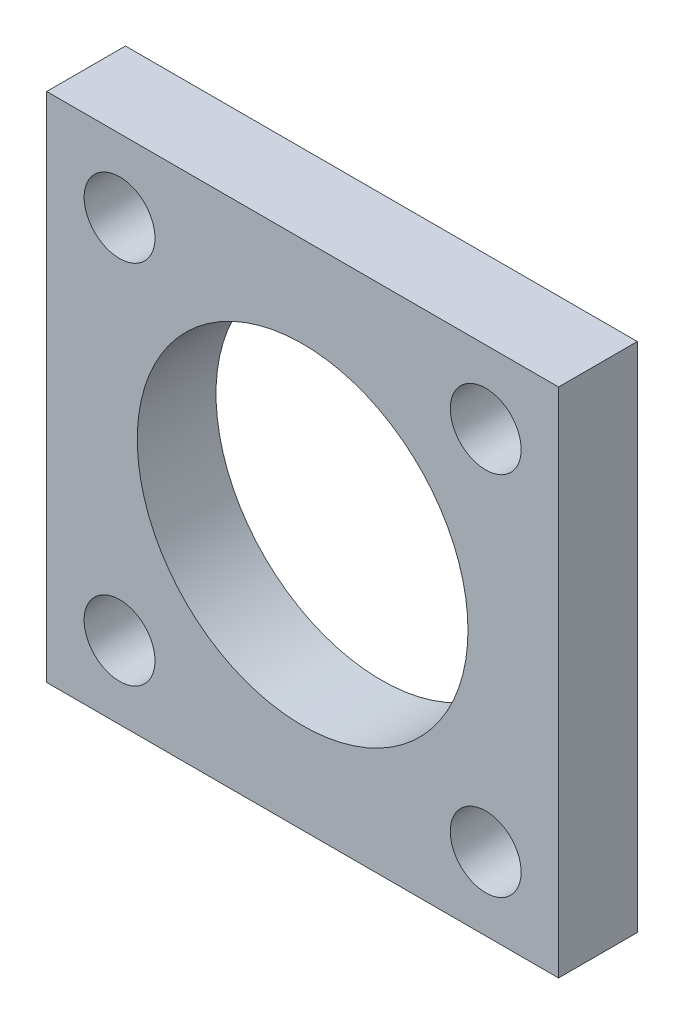
ISO-10303-21;
HEADER;
FILE_DESCRIPTION(('STEP AP214'),'2;1');
FILE_NAME('part.step','',(''),(''),'','','');
FILE_SCHEMA(('AUTOMOTIVE_DESIGN { 1 0 10303 214 1 1 1 1 }'));
ENDSEC;
DATA;
#1=APPLICATION_CONTEXT('core data for automotive mechanical design processes');
#2=APPLICATION_PROTOCOL_DEFINITION('international standard','automotive_design',2000,#1);
#3=PRODUCT_CONTEXT('',#1,'mechanical');
#4=PRODUCT('Part','Part','',(#3));
#5=PRODUCT_RELATED_PRODUCT_CATEGORY('part','',(#4));
#6=PRODUCT_DEFINITION_FORMATION('','',#4);
#7=PRODUCT_DEFINITION_CONTEXT('part definition',#1,'design');
#8=PRODUCT_DEFINITION('design','',#6,#7);
#9=PRODUCT_DEFINITION_SHAPE('','',#8);
#10=(LENGTH_UNIT() NAMED_UNIT(*) SI_UNIT(.MILLI.,.METRE.));
#11=(NAMED_UNIT(*) PLANE_ANGLE_UNIT() SI_UNIT($,.RADIAN.));
#12=(NAMED_UNIT(*) SI_UNIT($,.STERADIAN.) SOLID_ANGLE_UNIT());
#13=UNCERTAINTY_MEASURE_WITH_UNIT(LENGTH_MEASURE(1.E-05),#10,'distance_accuracy_value','');
#14=(GEOMETRIC_REPRESENTATION_CONTEXT(3) GLOBAL_UNCERTAINTY_ASSIGNED_CONTEXT((#13)) GLOBAL_UNIT_ASSIGNED_CONTEXT((#10,
#11,#12)) REPRESENTATION_CONTEXT('',''));
#15=CARTESIAN_POINT('',(0.,0.,0.));
#16=DIRECTION('',(0.,0.,1.));
#17=DIRECTION('',(1.,0.,0.));
#18=AXIS2_PLACEMENT_3D('',#15,#16,#17);
#19=CARTESIAN_POINT('',(0.,0.,10.));
#20=DIRECTION('',(0.,0.,1.));
#21=DIRECTION('',(1.,0.,0.));
#22=AXIS2_PLACEMENT_3D('',#19,#20,#21);
#23=PLANE('',#22);
#24=CARTESIAN_POINT('',(23.25,-23.25,10.));
#25=DIRECTION('',(0.,0.,1.));
#26=DIRECTION('',(1.,0.,0.));
#27=AXIS2_PLACEMENT_3D('',#24,#25,#26);
#28=CIRCLE('',#27,4.5);
#29=CARTESIAN_POINT('',(27.75,-23.25,10.));
#30=VERTEX_POINT('',#29);
#31=EDGE_CURVE('E150',#30,#30,#28,.T.);
#32=ORIENTED_EDGE('',*,*,#31,.F.);
#33=EDGE_LOOP('',(#32));
#34=FACE_BOUND('',#33,.T.);
#35=CARTESIAN_POINT('',(0.,0.,10.));
#36=DIRECTION('',(0.,0.,1.));
#37=DIRECTION('',(1.,0.,0.));
#38=AXIS2_PLACEMENT_3D('',#35,#36,#37);
#39=CIRCLE('',#38,21.);
#40=CARTESIAN_POINT('',(21.,0.,10.));
#41=VERTEX_POINT('',#40);
#42=EDGE_CURVE('E134',#41,#41,#39,.T.);
#43=ORIENTED_EDGE('',*,*,#42,.F.);
#44=EDGE_LOOP('',(#43));
#45=FACE_BOUND('',#44,.T.);
#46=DIRECTION('',(0.,1.,0.));
#47=VECTOR('',#46,1.);
#48=CARTESIAN_POINT('',(32.5,32.5,10.));
#49=LINE('',#48,#47);
#50=CARTESIAN_POINT('',(32.5,-32.5,10.));
#51=VERTEX_POINT('',#50);
#52=CARTESIAN_POINT('',(32.5,32.5,10.));
#53=VERTEX_POINT('',#52);
#54=EDGE_CURVE('E92',#51,#53,#49,.T.);
#55=ORIENTED_EDGE('',*,*,#54,.T.);
#56=DIRECTION('',(-1.,0.,0.));
#57=VECTOR('',#56,1.);
#58=CARTESIAN_POINT('',(-32.5,32.5,10.));
#59=LINE('',#58,#57);
#60=CARTESIAN_POINT('',(-32.5,32.5,10.));
#61=VERTEX_POINT('',#60);
#62=EDGE_CURVE('E87',#53,#61,#59,.T.);
#63=ORIENTED_EDGE('',*,*,#62,.T.);
#64=DIRECTION('',(0.,-1.,0.));
#65=VECTOR('',#64,1.);
#66=CARTESIAN_POINT('',(-32.5,32.5,10.));
#67=LINE('',#66,#65);
#68=CARTESIAN_POINT('',(-32.5,-32.5,10.));
#69=VERTEX_POINT('',#68);
#70=EDGE_CURVE('E90',#61,#69,#67,.T.);
#71=ORIENTED_EDGE('',*,*,#70,.T.);
#72=DIRECTION('',(1.,0.,0.));
#73=VECTOR('',#72,1.);
#74=CARTESIAN_POINT('',(-32.5,-32.5,10.));
#75=LINE('',#74,#73);
#76=EDGE_CURVE('E57',#69,#51,#75,.T.);
#77=ORIENTED_EDGE('',*,*,#76,.T.);
#78=EDGE_LOOP('',(#55,#63,#71,#77));
#79=FACE_BOUND('',#78,.T.);
#80=CARTESIAN_POINT('',(-23.25,23.25,10.));
#81=DIRECTION('',(0.,0.,1.));
#82=DIRECTION('',(1.,0.,0.));
#83=AXIS2_PLACEMENT_3D('',#80,#81,#82);
#84=CIRCLE('',#83,4.5);
#85=CARTESIAN_POINT('',(-18.75,23.25,10.));
#86=VERTEX_POINT('',#85);
#87=EDGE_CURVE('E112',#86,#86,#84,.T.);
#88=ORIENTED_EDGE('',*,*,#87,.F.);
#89=EDGE_LOOP('',(#88));
#90=FACE_BOUND('',#89,.T.);
#91=CARTESIAN_POINT('',(23.25,23.25,10.));
#92=DIRECTION('',(0.,0.,1.));
#93=DIRECTION('',(1.,0.,0.));
#94=AXIS2_PLACEMENT_3D('',#91,#92,#93);
#95=CIRCLE('',#94,4.5);
#96=CARTESIAN_POINT('',(27.75,23.25,10.));
#97=VERTEX_POINT('',#96);
#98=EDGE_CURVE('E142',#97,#97,#95,.T.);
#99=ORIENTED_EDGE('',*,*,#98,.F.);
#100=EDGE_LOOP('',(#99));
#101=FACE_BOUND('',#100,.T.);
#102=CARTESIAN_POINT('',(-23.25,-23.25,10.));
#103=DIRECTION('',(0.,0.,1.));
#104=DIRECTION('',(1.,0.,0.));
#105=AXIS2_PLACEMENT_3D('',#102,#103,#104);
#106=CIRCLE('',#105,4.5);
#107=CARTESIAN_POINT('',(-18.75,-23.25,10.));
#108=VERTEX_POINT('',#107);
#109=EDGE_CURVE('E158',#108,#108,#106,.T.);
#110=ORIENTED_EDGE('',*,*,#109,.F.);
#111=EDGE_LOOP('',(#110));
#112=FACE_BOUND('',#111,.T.);
#113=ADVANCED_FACE('F39',(#34,#45,#79,#90,#101,#112),#23,.T.);
#114=CARTESIAN_POINT('',(0.,0.,0.));
#115=DIRECTION('',(0.,0.,1.));
#116=DIRECTION('',(1.,0.,0.));
#117=AXIS2_PLACEMENT_3D('',#114,#115,#116);
#118=PLANE('',#117);
#119=DIRECTION('',(0.,1.,0.));
#120=VECTOR('',#119,1.);
#121=CARTESIAN_POINT('',(32.5,32.5,0.));
#122=LINE('',#121,#120);
#123=CARTESIAN_POINT('',(32.5,-32.5,0.));
#124=VERTEX_POINT('',#123);
#125=CARTESIAN_POINT('',(32.5,32.5,0.));
#126=VERTEX_POINT('',#125);
#127=EDGE_CURVE('E108',#124,#126,#122,.T.);
#128=ORIENTED_EDGE('',*,*,#127,.F.);
#129=DIRECTION('',(1.,0.,0.));
#130=VECTOR('',#129,1.);
#131=CARTESIAN_POINT('',(-32.5,-32.5,0.));
#132=LINE('',#131,#130);
#133=CARTESIAN_POINT('',(-32.5,-32.5,0.));
#134=VERTEX_POINT('',#133);
#135=EDGE_CURVE('E80',#134,#124,#132,.T.);
#136=ORIENTED_EDGE('',*,*,#135,.F.);
#137=DIRECTION('',(0.,-1.,0.));
#138=VECTOR('',#137,1.);
#139=CARTESIAN_POINT('',(-32.5,32.5,0.));
#140=LINE('',#139,#138);
#141=CARTESIAN_POINT('',(-32.5,32.5,0.));
#142=VERTEX_POINT('',#141);
#143=EDGE_CURVE('E74',#142,#134,#140,.T.);
#144=ORIENTED_EDGE('',*,*,#143,.F.);
#145=DIRECTION('',(-1.,0.,0.));
#146=VECTOR('',#145,1.);
#147=CARTESIAN_POINT('',(-32.5,32.5,0.));
#148=LINE('',#147,#146);
#149=EDGE_CURVE('E97',#126,#142,#148,.T.);
#150=ORIENTED_EDGE('',*,*,#149,.F.);
#151=EDGE_LOOP('',(#128,#136,#144,#150));
#152=FACE_BOUND('',#151,.T.);
#153=CARTESIAN_POINT('',(-23.25,23.25,0.));
#154=DIRECTION('',(0.,0.,1.));
#155=DIRECTION('',(1.,0.,0.));
#156=AXIS2_PLACEMENT_3D('',#153,#154,#155);
#157=CIRCLE('',#156,4.5);
#158=CARTESIAN_POINT('',(-18.75,23.25,0.));
#159=VERTEX_POINT('',#158);
#160=EDGE_CURVE('E130',#159,#159,#157,.T.);
#161=ORIENTED_EDGE('',*,*,#160,.T.);
#162=EDGE_LOOP('',(#161));
#163=FACE_BOUND('',#162,.T.);
#164=CARTESIAN_POINT('',(0.,0.,0.));
#165=DIRECTION('',(0.,0.,1.));
#166=DIRECTION('',(1.,0.,0.));
#167=AXIS2_PLACEMENT_3D('',#164,#165,#166);
#168=CIRCLE('',#167,21.);
#169=CARTESIAN_POINT('',(21.,0.,0.));
#170=VERTEX_POINT('',#169);
#171=EDGE_CURVE('E138',#170,#170,#168,.T.);
#172=ORIENTED_EDGE('',*,*,#171,.T.);
#173=EDGE_LOOP('',(#172));
#174=FACE_BOUND('',#173,.T.);
#175=CARTESIAN_POINT('',(23.25,23.25,0.));
#176=DIRECTION('',(0.,0.,1.));
#177=DIRECTION('',(1.,0.,0.));
#178=AXIS2_PLACEMENT_3D('',#175,#176,#177);
#179=CIRCLE('',#178,4.5);
#180=CARTESIAN_POINT('',(27.75,23.25,0.));
#181=VERTEX_POINT('',#180);
#182=EDGE_CURVE('E146',#181,#181,#179,.T.);
#183=ORIENTED_EDGE('',*,*,#182,.T.);
#184=EDGE_LOOP('',(#183));
#185=FACE_BOUND('',#184,.T.);
#186=CARTESIAN_POINT('',(23.25,-23.25,0.));
#187=DIRECTION('',(0.,0.,1.));
#188=DIRECTION('',(1.,0.,0.));
#189=AXIS2_PLACEMENT_3D('',#186,#187,#188);
#190=CIRCLE('',#189,4.5);
#191=CARTESIAN_POINT('',(27.75,-23.25,0.));
#192=VERTEX_POINT('',#191);
#193=EDGE_CURVE('E154',#192,#192,#190,.T.);
#194=ORIENTED_EDGE('',*,*,#193,.T.);
#195=EDGE_LOOP('',(#194));
#196=FACE_BOUND('',#195,.T.);
#197=CARTESIAN_POINT('',(-23.25,-23.25,0.));
#198=DIRECTION('',(0.,0.,1.));
#199=DIRECTION('',(1.,0.,0.));
#200=AXIS2_PLACEMENT_3D('',#197,#198,#199);
#201=CIRCLE('',#200,4.5);
#202=CARTESIAN_POINT('',(-18.75,-23.25,0.));
#203=VERTEX_POINT('',#202);
#204=EDGE_CURVE('E162',#203,#203,#201,.T.);
#205=ORIENTED_EDGE('',*,*,#204,.T.);
#206=EDGE_LOOP('',(#205));
#207=FACE_BOUND('',#206,.T.);
#208=ADVANCED_FACE('F125',(#152,#163,#174,#185,#196,#207),#118,.F.);
#209=CARTESIAN_POINT('',(32.5,32.5,10.));
#210=DIRECTION('',(-1.,0.,0.));
#211=DIRECTION('',(0.,0.,1.));
#212=AXIS2_PLACEMENT_3D('',#209,#210,#211);
#213=PLANE('',#212);
#214=ORIENTED_EDGE('',*,*,#127,.T.);
#215=DIRECTION('',(0.,0.,-1.));
#216=VECTOR('',#215,1.);
#217=CARTESIAN_POINT('',(32.5,32.5,10.));
#218=LINE('',#217,#216);
#219=EDGE_CURVE('E11',#53,#126,#218,.T.);
#220=ORIENTED_EDGE('',*,*,#219,.F.);
#221=ORIENTED_EDGE('',*,*,#54,.F.);
#222=DIRECTION('',(0.,0.,-1.));
#223=VECTOR('',#222,1.);
#224=CARTESIAN_POINT('',(32.5,-32.5,10.));
#225=LINE('',#224,#223);
#226=EDGE_CURVE('E104',#51,#124,#225,.T.);
#227=ORIENTED_EDGE('',*,*,#226,.T.);
#228=EDGE_LOOP('',(#214,#220,#221,#227));
#229=FACE_BOUND('',#228,.T.);
#230=ADVANCED_FACE('F41',(#229),#213,.F.);
#231=CARTESIAN_POINT('',(-32.5,32.5,10.));
#232=DIRECTION('',(0.,-1.,0.));
#233=DIRECTION('',(0.,0.,-1.));
#234=AXIS2_PLACEMENT_3D('',#231,#232,#233);
#235=PLANE('',#234);
#236=ORIENTED_EDGE('',*,*,#149,.T.);
#237=DIRECTION('',(0.,0.,-1.));
#238=VECTOR('',#237,1.);
#239=CARTESIAN_POINT('',(-32.5,32.5,10.));
#240=LINE('',#239,#238);
#241=EDGE_CURVE('E49',#61,#142,#240,.T.);
#242=ORIENTED_EDGE('',*,*,#241,.F.);
#243=ORIENTED_EDGE('',*,*,#62,.F.);
#244=ORIENTED_EDGE('',*,*,#219,.T.);
#245=EDGE_LOOP('',(#236,#242,#243,#244));
#246=FACE_BOUND('',#245,.T.);
#247=ADVANCED_FACE('F96',(#246),#235,.F.);
#248=CARTESIAN_POINT('',(-32.5,32.5,10.));
#249=DIRECTION('',(1.,0.,0.));
#250=DIRECTION('',(0.,1.,0.));
#251=AXIS2_PLACEMENT_3D('',#248,#249,#250);
#252=PLANE('',#251);
#253=ORIENTED_EDGE('',*,*,#143,.T.);
#254=DIRECTION('',(0.,0.,-1.));
#255=VECTOR('',#254,1.);
#256=CARTESIAN_POINT('',(-32.5,-32.5,10.));
#257=LINE('',#256,#255);
#258=EDGE_CURVE('E99',#69,#134,#257,.T.);
#259=ORIENTED_EDGE('',*,*,#258,.F.);
#260=ORIENTED_EDGE('',*,*,#70,.F.);
#261=ORIENTED_EDGE('',*,*,#241,.T.);
#262=EDGE_LOOP('',(#253,#259,#260,#261));
#263=FACE_BOUND('',#262,.T.);
#264=ADVANCED_FACE('F100',(#263),#252,.F.);
#265=CARTESIAN_POINT('',(-32.5,-32.5,10.));
#266=DIRECTION('',(0.,1.,0.));
#267=DIRECTION('',(0.,0.,1.));
#268=AXIS2_PLACEMENT_3D('',#265,#266,#267);
#269=PLANE('',#268);
#270=ORIENTED_EDGE('',*,*,#135,.T.);
#271=ORIENTED_EDGE('',*,*,#226,.F.);
#272=ORIENTED_EDGE('',*,*,#76,.F.);
#273=ORIENTED_EDGE('',*,*,#258,.T.);
#274=EDGE_LOOP('',(#270,#271,#272,#273));
#275=FACE_BOUND('',#274,.T.);
#276=ADVANCED_FACE('F122',(#275),#269,.F.);
#277=CARTESIAN_POINT('',(-23.25,23.25,10.));
#278=DIRECTION('',(0.,0.,-1.));
#279=DIRECTION('',(-1.,0.,0.));
#280=AXIS2_PLACEMENT_3D('',#277,#278,#279);
#281=CYLINDRICAL_SURFACE('',#280,4.5);
#282=ORIENTED_EDGE('',*,*,#87,.T.);
#283=EDGE_LOOP('',(#282));
#284=FACE_BOUND('',#283,.T.);
#285=ORIENTED_EDGE('',*,*,#160,.F.);
#286=EDGE_LOOP('',(#285));
#287=FACE_BOUND('',#286,.T.);
#288=ADVANCED_FACE('F183',(#284,#287),#281,.F.);
#289=CARTESIAN_POINT('',(0.,0.,10.));
#290=DIRECTION('',(0.,0.,-1.));
#291=DIRECTION('',(-1.,0.,0.));
#292=AXIS2_PLACEMENT_3D('',#289,#290,#291);
#293=CYLINDRICAL_SURFACE('',#292,21.);
#294=ORIENTED_EDGE('',*,*,#42,.T.);
#295=EDGE_LOOP('',(#294));
#296=FACE_BOUND('',#295,.T.);
#297=ORIENTED_EDGE('',*,*,#171,.F.);
#298=EDGE_LOOP('',(#297));
#299=FACE_BOUND('',#298,.T.);
#300=ADVANCED_FACE('F229',(#296,#299),#293,.F.);
#301=CARTESIAN_POINT('',(23.25,23.25,10.));
#302=DIRECTION('',(0.,0.,-1.));
#303=DIRECTION('',(-1.,0.,0.));
#304=AXIS2_PLACEMENT_3D('',#301,#302,#303);
#305=CYLINDRICAL_SURFACE('',#304,4.5);
#306=ORIENTED_EDGE('',*,*,#98,.T.);
#307=EDGE_LOOP('',(#306));
#308=FACE_BOUND('',#307,.T.);
#309=ORIENTED_EDGE('',*,*,#182,.F.);
#310=EDGE_LOOP('',(#309));
#311=FACE_BOUND('',#310,.T.);
#312=ADVANCED_FACE('F237',(#308,#311),#305,.F.);
#313=CARTESIAN_POINT('',(23.25,-23.25,10.));
#314=DIRECTION('',(0.,0.,-1.));
#315=DIRECTION('',(-1.,0.,0.));
#316=AXIS2_PLACEMENT_3D('',#313,#314,#315);
#317=CYLINDRICAL_SURFACE('',#316,4.5);
#318=ORIENTED_EDGE('',*,*,#31,.T.);
#319=EDGE_LOOP('',(#318));
#320=FACE_BOUND('',#319,.T.);
#321=ORIENTED_EDGE('',*,*,#193,.F.);
#322=EDGE_LOOP('',(#321));
#323=FACE_BOUND('',#322,.T.);
#324=ADVANCED_FACE('F245',(#320,#323),#317,.F.);
#325=CARTESIAN_POINT('',(-23.25,-23.25,10.));
#326=DIRECTION('',(0.,0.,-1.));
#327=DIRECTION('',(-1.,0.,0.));
#328=AXIS2_PLACEMENT_3D('',#325,#326,#327);
#329=CYLINDRICAL_SURFACE('',#328,4.5);
#330=ORIENTED_EDGE('',*,*,#109,.T.);
#331=EDGE_LOOP('',(#330));
#332=FACE_BOUND('',#331,.T.);
#333=ORIENTED_EDGE('',*,*,#204,.F.);
#334=EDGE_LOOP('',(#333));
#335=FACE_BOUND('',#334,.T.);
#336=ADVANCED_FACE('F170',(#332,#335),#329,.F.);
#337=CLOSED_SHELL('',(#113,#208,#230,#247,#264,#276,#288,#300,#312,#324,#336));
#338=MANIFOLD_SOLID_BREP('B2',#337);
#339=ADVANCED_BREP_SHAPE_REPRESENTATION('',(#18,#338),#14);
#340=SHAPE_DEFINITION_REPRESENTATION(#9,#339);
ENDSEC;
END-ISO-10303-21;
